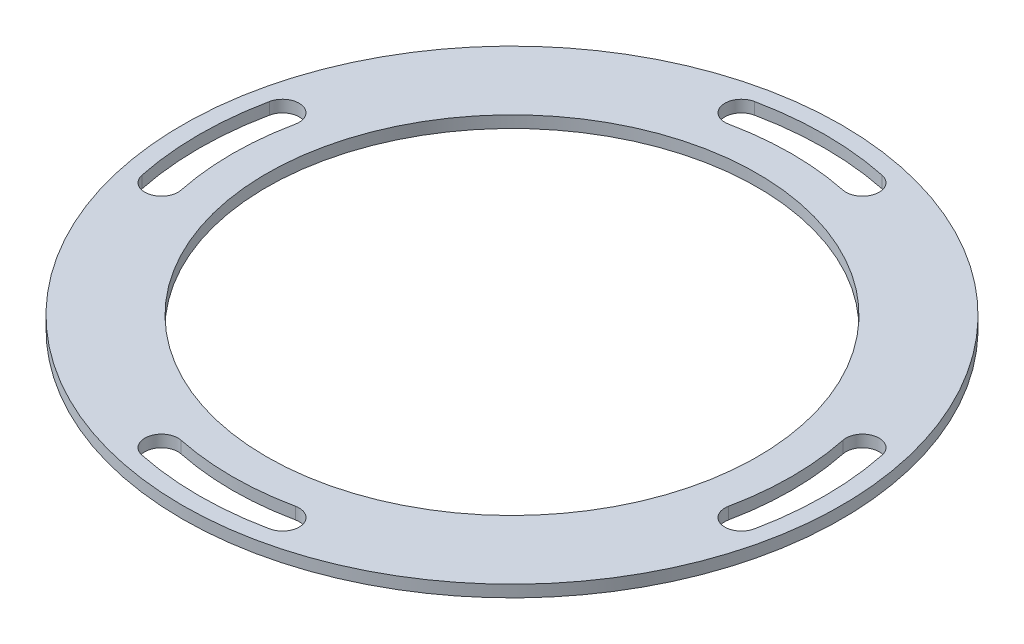
ISO-10303-21;
HEADER;
FILE_DESCRIPTION(('STEP AP214'),'2;1');
FILE_NAME('part.step','',(''),(''),'','','');
FILE_SCHEMA(('AUTOMOTIVE_DESIGN { 1 0 10303 214 1 1 1 1 }'));
ENDSEC;
DATA;
#1=APPLICATION_CONTEXT('core data for automotive mechanical design processes');
#2=APPLICATION_PROTOCOL_DEFINITION('international standard','automotive_design',2000,#1);
#3=PRODUCT_CONTEXT('',#1,'mechanical');
#4=PRODUCT('Part','Part','',(#3));
#5=PRODUCT_RELATED_PRODUCT_CATEGORY('part','',(#4));
#6=PRODUCT_DEFINITION_FORMATION('','',#4);
#7=PRODUCT_DEFINITION_CONTEXT('part definition',#1,'design');
#8=PRODUCT_DEFINITION('design','',#6,#7);
#9=PRODUCT_DEFINITION_SHAPE('','',#8);
#10=(LENGTH_UNIT() NAMED_UNIT(*) SI_UNIT(.MILLI.,.METRE.));
#11=(NAMED_UNIT(*) PLANE_ANGLE_UNIT() SI_UNIT($,.RADIAN.));
#12=(NAMED_UNIT(*) SI_UNIT($,.STERADIAN.) SOLID_ANGLE_UNIT());
#13=UNCERTAINTY_MEASURE_WITH_UNIT(LENGTH_MEASURE(1.E-05),#10,'distance_accuracy_value','');
#14=(GEOMETRIC_REPRESENTATION_CONTEXT(3) GLOBAL_UNCERTAINTY_ASSIGNED_CONTEXT((#13)) GLOBAL_UNIT_ASSIGNED_CONTEXT((#10,
#11,#12)) REPRESENTATION_CONTEXT('',''));
#15=CARTESIAN_POINT('',(0.,0.,0.));
#16=DIRECTION('',(0.,0.,1.));
#17=DIRECTION('',(1.,0.,0.));
#18=AXIS2_PLACEMENT_3D('',#15,#16,#17);
#19=CARTESIAN_POINT('',(0.,2.5,0.));
#20=DIRECTION('',(0.,1.,0.));
#21=DIRECTION('',(0.,0.,1.));
#22=AXIS2_PLACEMENT_3D('',#19,#20,#21);
#23=PLANE('',#22);
#24=CARTESIAN_POINT('',(0.,2.5,0.));
#25=DIRECTION('',(0.,1.,0.));
#26=DIRECTION('',(0.,0.,1.));
#27=AXIS2_PLACEMENT_3D('',#24,#25,#26);
#28=CIRCLE('',#27,139.);
#29=CARTESIAN_POINT('',(0.,2.5,139.));
#30=VERTEX_POINT('',#29);
#31=EDGE_CURVE('E11',#30,#30,#28,.T.);
#32=ORIENTED_EDGE('',*,*,#31,.T.);
#33=EDGE_LOOP('',(#32));
#34=FACE_BOUND('',#33,.T.);
#35=CARTESIAN_POINT('',(0.,2.5,0.));
#36=DIRECTION('',(0.,1.,0.));
#37=DIRECTION('',(0.,0.,1.));
#38=AXIS2_PLACEMENT_3D('',#35,#36,#37);
#39=CIRCLE('',#38,103.5);
#40=CARTESIAN_POINT('',(0.,2.5,103.5));
#41=VERTEX_POINT('',#40);
#42=EDGE_CURVE('E276',#41,#41,#39,.T.);
#43=ORIENTED_EDGE('',*,*,#42,.F.);
#44=EDGE_LOOP('',(#43));
#45=FACE_BOUND('',#44,.T.);
#46=CARTESIAN_POINT('',(-122.320836066701,2.5,25.5288359787017));
#47=DIRECTION('',(0.,1.,0.));
#48=DIRECTION('',(0.,0.,-1.));
#49=AXIS2_PLACEMENT_3D('',#46,#47,#48);
#50=CIRCLE('',#49,7.);
#51=CARTESIAN_POINT('',(-129.173191561911,2.5,26.9589493194052));
#52=VERTEX_POINT('',#51);
#53=CARTESIAN_POINT('',(-115.46848057149,2.5,24.0987226379983));
#54=VERTEX_POINT('',#53);
#55=EDGE_CURVE('E247',#52,#54,#50,.T.);
#56=ORIENTED_EDGE('',*,*,#55,.F.);
#57=CARTESIAN_POINT('',(0.,2.5,0.));
#58=DIRECTION('',(0.,1.,0.));
#59=DIRECTION('',(0.,0.,1.));
#60=AXIS2_PLACEMENT_3D('',#57,#58,#59);
#61=CIRCLE('',#60,131.956426015168);
#62=CARTESIAN_POINT('',(-129.173191561911,2.5,-26.9589493194051));
#63=VERTEX_POINT('',#62);
#64=EDGE_CURVE('E245',#63,#52,#61,.T.);
#65=ORIENTED_EDGE('',*,*,#64,.F.);
#66=CARTESIAN_POINT('',(-122.320836066701,2.5,-25.5288359787017));
#67=DIRECTION('',(0.,1.,0.));
#68=DIRECTION('',(0.,0.,1.));
#69=AXIS2_PLACEMENT_3D('',#66,#67,#68);
#70=CIRCLE('',#69,7.);
#71=CARTESIAN_POINT('',(-115.46848057149,2.5,-24.0987226379983));
#72=VERTEX_POINT('',#71);
#73=EDGE_CURVE('E253',#72,#63,#70,.T.);
#74=ORIENTED_EDGE('',*,*,#73,.F.);
#75=CARTESIAN_POINT('',(0.,2.5,0.));
#76=DIRECTION('',(0.,-1.,0.));
#77=DIRECTION('',(0.,0.,1.));
#78=AXIS2_PLACEMENT_3D('',#75,#76,#77);
#79=CIRCLE('',#78,117.956426015168);
#80=EDGE_CURVE('E250',#54,#72,#79,.T.);
#81=ORIENTED_EDGE('',*,*,#80,.F.);
#82=EDGE_LOOP('',(#56,#65,#74,#81));
#83=FACE_BOUND('',#82,.T.);
#84=CARTESIAN_POINT('',(0.,2.5,0.));
#85=DIRECTION('',(0.,1.,0.));
#86=DIRECTION('',(0.,0.,1.));
#87=AXIS2_PLACEMENT_3D('',#84,#85,#86);
#88=CIRCLE('',#87,131.956426015168);
#89=CARTESIAN_POINT('',(26.9589493194056,2.5,-129.173191561911));
#90=VERTEX_POINT('',#89);
#91=CARTESIAN_POINT('',(-26.9589493194047,2.5,-129.173191561911));
#92=VERTEX_POINT('',#91);
#93=EDGE_CURVE('E216',#90,#92,#88,.T.);
#94=ORIENTED_EDGE('',*,*,#93,.F.);
#95=CARTESIAN_POINT('',(25.5288359787021,2.5,-122.320836066701));
#96=DIRECTION('',(0.,1.,0.));
#97=DIRECTION('',(0.,0.,1.));
#98=AXIS2_PLACEMENT_3D('',#95,#96,#97);
#99=CIRCLE('',#98,7.00000000000001);
#100=CARTESIAN_POINT('',(24.0987226379987,2.5,-115.46848057149));
#101=VERTEX_POINT('',#100);
#102=EDGE_CURVE('E214',#101,#90,#99,.T.);
#103=ORIENTED_EDGE('',*,*,#102,.F.);
#104=CARTESIAN_POINT('',(0.,2.5,0.));
#105=DIRECTION('',(0.,-1.,0.));
#106=DIRECTION('',(0.,0.,1.));
#107=AXIS2_PLACEMENT_3D('',#104,#105,#106);
#108=CIRCLE('',#107,117.956426015168);
#109=CARTESIAN_POINT('',(-24.0987226379979,2.5,-115.46848057149));
#110=VERTEX_POINT('',#109);
#111=EDGE_CURVE('E222',#110,#101,#108,.T.);
#112=ORIENTED_EDGE('',*,*,#111,.F.);
#113=CARTESIAN_POINT('',(-25.5288359787013,2.5,-122.320836066701));
#114=DIRECTION('',(0.,1.,0.));
#115=DIRECTION('',(0.,0.,-1.));
#116=AXIS2_PLACEMENT_3D('',#113,#114,#115);
#117=CIRCLE('',#116,7.);
#118=EDGE_CURVE('E219',#92,#110,#117,.T.);
#119=ORIENTED_EDGE('',*,*,#118,.F.);
#120=EDGE_LOOP('',(#94,#103,#112,#119));
#121=FACE_BOUND('',#120,.T.);
#122=CARTESIAN_POINT('',(0.,2.5,0.));
#123=DIRECTION('',(0.,1.,0.));
#124=DIRECTION('',(0.,0.,1.));
#125=AXIS2_PLACEMENT_3D('',#122,#123,#124);
#126=CIRCLE('',#125,131.956426015168);
#127=CARTESIAN_POINT('',(129.173191561911,2.5,26.958949319406));
#128=VERTEX_POINT('',#127);
#129=CARTESIAN_POINT('',(129.173191561911,2.5,-26.9589493194043));
#130=VERTEX_POINT('',#129);
#131=EDGE_CURVE('E185',#128,#130,#126,.T.);
#132=ORIENTED_EDGE('',*,*,#131,.F.);
#133=CARTESIAN_POINT('',(122.320836066701,2.5,25.5288359787026));
#134=DIRECTION('',(0.,1.,0.));
#135=DIRECTION('',(0.,0.,1.));
#136=AXIS2_PLACEMENT_3D('',#133,#134,#135);
#137=CIRCLE('',#136,7.);
#138=CARTESIAN_POINT('',(115.46848057149,2.5,24.0987226379991));
#139=VERTEX_POINT('',#138);
#140=EDGE_CURVE('E183',#139,#128,#137,.T.);
#141=ORIENTED_EDGE('',*,*,#140,.F.);
#142=CARTESIAN_POINT('',(0.,2.5,0.));
#143=DIRECTION('',(0.,-1.,0.));
#144=DIRECTION('',(0.,0.,1.));
#145=AXIS2_PLACEMENT_3D('',#142,#143,#144);
#146=CIRCLE('',#145,117.956426015168);
#147=CARTESIAN_POINT('',(115.46848057149,2.5,-24.0987226379975));
#148=VERTEX_POINT('',#147);
#149=EDGE_CURVE('E191',#148,#139,#146,.T.);
#150=ORIENTED_EDGE('',*,*,#149,.F.);
#151=CARTESIAN_POINT('',(122.320836066701,2.5,-25.5288359787009));
#152=DIRECTION('',(0.,1.,0.));
#153=DIRECTION('',(0.,0.,-1.));
#154=AXIS2_PLACEMENT_3D('',#151,#152,#153);
#155=CIRCLE('',#154,7.00000000000001);
#156=EDGE_CURVE('E188',#130,#148,#155,.T.);
#157=ORIENTED_EDGE('',*,*,#156,.F.);
#158=EDGE_LOOP('',(#132,#141,#150,#157));
#159=FACE_BOUND('',#158,.T.);
#160=CARTESIAN_POINT('',(0.,2.5,0.));
#161=DIRECTION('',(0.,1.,0.));
#162=DIRECTION('',(0.,0.,1.));
#163=AXIS2_PLACEMENT_3D('',#160,#161,#162);
#164=CIRCLE('',#163,131.956426015168);
#165=CARTESIAN_POINT('',(-26.9589493194066,2.5,129.173191561911));
#166=VERTEX_POINT('',#165);
#167=CARTESIAN_POINT('',(26.9589493194038,2.5,129.173191561912));
#168=VERTEX_POINT('',#167);
#169=EDGE_CURVE('E155',#166,#168,#164,.T.);
#170=ORIENTED_EDGE('',*,*,#169,.F.);
#171=CARTESIAN_POINT('',(-25.528835978703,2.5,122.3208360667));
#172=DIRECTION('',(0.,1.,0.));
#173=DIRECTION('',(0.,0.,1.));
#174=AXIS2_PLACEMENT_3D('',#171,#172,#173);
#175=CIRCLE('',#174,7.);
#176=CARTESIAN_POINT('',(-24.0987226379996,2.5,115.46848057149));
#177=VERTEX_POINT('',#176);
#178=EDGE_CURVE('E147',#177,#166,#175,.T.);
#179=ORIENTED_EDGE('',*,*,#178,.F.);
#180=CARTESIAN_POINT('',(0.,2.5,0.));
#181=DIRECTION('',(0.,-1.,0.));
#182=DIRECTION('',(0.,0.,1.));
#183=AXIS2_PLACEMENT_3D('',#180,#181,#182);
#184=CIRCLE('',#183,117.956426015168);
#185=CARTESIAN_POINT('',(24.0987226379971,2.5,115.46848057149));
#186=VERTEX_POINT('',#185);
#187=EDGE_CURVE('E169',#186,#177,#184,.T.);
#188=ORIENTED_EDGE('',*,*,#187,.F.);
#189=CARTESIAN_POINT('',(25.5288359787005,2.5,122.320836066701));
#190=DIRECTION('',(0.,1.,0.));
#191=DIRECTION('',(0.,0.,-1.));
#192=AXIS2_PLACEMENT_3D('',#189,#190,#191);
#193=CIRCLE('',#192,7.);
#194=EDGE_CURVE('E167',#168,#186,#193,.T.);
#195=ORIENTED_EDGE('',*,*,#194,.F.);
#196=EDGE_LOOP('',(#170,#179,#188,#195));
#197=FACE_BOUND('',#196,.T.);
#198=ADVANCED_FACE('F34',(#34,#45,#83,#121,#159,#197),#23,.T.);
#199=CARTESIAN_POINT('',(0.,-2.5,0.));
#200=DIRECTION('',(0.,1.,0.));
#201=DIRECTION('',(0.,0.,1.));
#202=AXIS2_PLACEMENT_3D('',#199,#200,#201);
#203=PLANE('',#202);
#204=CARTESIAN_POINT('',(122.320836066701,-2.5,25.5288359787026));
#205=DIRECTION('',(0.,1.,0.));
#206=DIRECTION('',(0.,0.,1.));
#207=AXIS2_PLACEMENT_3D('',#204,#205,#206);
#208=CIRCLE('',#207,7.);
#209=CARTESIAN_POINT('',(115.46848057149,-2.5,24.0987226379991));
#210=VERTEX_POINT('',#209);
#211=CARTESIAN_POINT('',(129.173191561911,-2.5,26.958949319406));
#212=VERTEX_POINT('',#211);
#213=EDGE_CURVE('E163',#210,#212,#208,.T.);
#214=ORIENTED_EDGE('',*,*,#213,.T.);
#215=CARTESIAN_POINT('',(0.,-2.5,0.));
#216=DIRECTION('',(0.,1.,0.));
#217=DIRECTION('',(0.,0.,1.));
#218=AXIS2_PLACEMENT_3D('',#215,#216,#217);
#219=CIRCLE('',#218,131.956426015168);
#220=CARTESIAN_POINT('',(129.173191561911,-2.5,-26.9589493194043));
#221=VERTEX_POINT('',#220);
#222=EDGE_CURVE('E196',#212,#221,#219,.T.);
#223=ORIENTED_EDGE('',*,*,#222,.T.);
#224=CARTESIAN_POINT('',(122.320836066701,-2.5,-25.5288359787009));
#225=DIRECTION('',(0.,1.,0.));
#226=DIRECTION('',(0.,0.,-1.));
#227=AXIS2_PLACEMENT_3D('',#224,#225,#226);
#228=CIRCLE('',#227,7.00000000000001);
#229=CARTESIAN_POINT('',(115.46848057149,-2.5,-24.0987226379975));
#230=VERTEX_POINT('',#229);
#231=EDGE_CURVE('E199',#221,#230,#228,.T.);
#232=ORIENTED_EDGE('',*,*,#231,.T.);
#233=CARTESIAN_POINT('',(0.,-2.5,0.));
#234=DIRECTION('',(0.,-1.,0.));
#235=DIRECTION('',(0.,0.,1.));
#236=AXIS2_PLACEMENT_3D('',#233,#234,#235);
#237=CIRCLE('',#236,117.956426015168);
#238=EDGE_CURVE('E186',#230,#210,#237,.T.);
#239=ORIENTED_EDGE('',*,*,#238,.T.);
#240=EDGE_LOOP('',(#214,#223,#232,#239));
#241=FACE_BOUND('',#240,.T.);
#242=CARTESIAN_POINT('',(0.,-2.5,0.));
#243=DIRECTION('',(0.,1.,0.));
#244=DIRECTION('',(0.,0.,1.));
#245=AXIS2_PLACEMENT_3D('',#242,#243,#244);
#246=CIRCLE('',#245,131.956426015168);
#247=CARTESIAN_POINT('',(-129.173191561911,-2.5,-26.9589493194051));
#248=VERTEX_POINT('',#247);
#249=CARTESIAN_POINT('',(-129.173191561911,-2.5,26.9589493194052));
#250=VERTEX_POINT('',#249);
#251=EDGE_CURVE('E244',#248,#250,#246,.T.);
#252=ORIENTED_EDGE('',*,*,#251,.T.);
#253=CARTESIAN_POINT('',(-122.320836066701,-2.5,25.5288359787017));
#254=DIRECTION('',(0.,1.,0.));
#255=DIRECTION('',(0.,0.,-1.));
#256=AXIS2_PLACEMENT_3D('',#253,#254,#255);
#257=CIRCLE('',#256,7.);
#258=CARTESIAN_POINT('',(-115.46848057149,-2.5,24.0987226379983));
#259=VERTEX_POINT('',#258);
#260=EDGE_CURVE('E258',#250,#259,#257,.T.);
#261=ORIENTED_EDGE('',*,*,#260,.T.);
#262=CARTESIAN_POINT('',(0.,-2.5,0.));
#263=DIRECTION('',(0.,-1.,0.));
#264=DIRECTION('',(0.,0.,1.));
#265=AXIS2_PLACEMENT_3D('',#262,#263,#264);
#266=CIRCLE('',#265,117.956426015168);
#267=CARTESIAN_POINT('',(-115.46848057149,-2.5,-24.0987226379983));
#268=VERTEX_POINT('',#267);
#269=EDGE_CURVE('E261',#259,#268,#266,.T.);
#270=ORIENTED_EDGE('',*,*,#269,.T.);
#271=CARTESIAN_POINT('',(-122.320836066701,-2.5,-25.5288359787017));
#272=DIRECTION('',(0.,1.,0.));
#273=DIRECTION('',(0.,0.,1.));
#274=AXIS2_PLACEMENT_3D('',#271,#272,#273);
#275=CIRCLE('',#274,7.);
#276=EDGE_CURVE('E248',#268,#248,#275,.T.);
#277=ORIENTED_EDGE('',*,*,#276,.T.);
#278=EDGE_LOOP('',(#252,#261,#270,#277));
#279=FACE_BOUND('',#278,.T.);
#280=CARTESIAN_POINT('',(0.,-2.5,0.));
#281=DIRECTION('',(0.,1.,0.));
#282=DIRECTION('',(0.,0.,1.));
#283=AXIS2_PLACEMENT_3D('',#280,#281,#282);
#284=CIRCLE('',#283,139.);
#285=CARTESIAN_POINT('',(0.,-2.5,139.));
#286=VERTEX_POINT('',#285);
#287=EDGE_CURVE('E38',#286,#286,#284,.T.);
#288=ORIENTED_EDGE('',*,*,#287,.F.);
#289=EDGE_LOOP('',(#288));
#290=FACE_BOUND('',#289,.T.);
#291=CARTESIAN_POINT('',(0.,-2.5,0.));
#292=DIRECTION('',(0.,1.,0.));
#293=DIRECTION('',(0.,0.,1.));
#294=AXIS2_PLACEMENT_3D('',#291,#292,#293);
#295=CIRCLE('',#294,103.5);
#296=CARTESIAN_POINT('',(0.,-2.5,103.5));
#297=VERTEX_POINT('',#296);
#298=EDGE_CURVE('E275',#297,#297,#295,.T.);
#299=ORIENTED_EDGE('',*,*,#298,.T.);
#300=EDGE_LOOP('',(#299));
#301=FACE_BOUND('',#300,.T.);
#302=CARTESIAN_POINT('',(25.5288359787021,-2.5,-122.320836066701));
#303=DIRECTION('',(0.,1.,0.));
#304=DIRECTION('',(0.,0.,1.));
#305=AXIS2_PLACEMENT_3D('',#302,#303,#304);
#306=CIRCLE('',#305,7.00000000000001);
#307=CARTESIAN_POINT('',(24.0987226379987,-2.5,-115.46848057149));
#308=VERTEX_POINT('',#307);
#309=CARTESIAN_POINT('',(26.9589493194056,-2.5,-129.173191561911));
#310=VERTEX_POINT('',#309);
#311=EDGE_CURVE('E213',#308,#310,#306,.T.);
#312=ORIENTED_EDGE('',*,*,#311,.T.);
#313=CARTESIAN_POINT('',(0.,-2.5,0.));
#314=DIRECTION('',(0.,1.,0.));
#315=DIRECTION('',(0.,0.,1.));
#316=AXIS2_PLACEMENT_3D('',#313,#314,#315);
#317=CIRCLE('',#316,131.956426015168);
#318=CARTESIAN_POINT('',(-26.9589493194047,-2.5,-129.173191561911));
#319=VERTEX_POINT('',#318);
#320=EDGE_CURVE('E227',#310,#319,#317,.T.);
#321=ORIENTED_EDGE('',*,*,#320,.T.);
#322=CARTESIAN_POINT('',(-25.5288359787013,-2.5,-122.320836066701));
#323=DIRECTION('',(0.,1.,0.));
#324=DIRECTION('',(0.,0.,-1.));
#325=AXIS2_PLACEMENT_3D('',#322,#323,#324);
#326=CIRCLE('',#325,7.);
#327=CARTESIAN_POINT('',(-24.0987226379979,-2.5,-115.46848057149));
#328=VERTEX_POINT('',#327);
#329=EDGE_CURVE('E230',#319,#328,#326,.T.);
#330=ORIENTED_EDGE('',*,*,#329,.T.);
#331=CARTESIAN_POINT('',(0.,-2.5,0.));
#332=DIRECTION('',(0.,-1.,0.));
#333=DIRECTION('',(0.,0.,1.));
#334=AXIS2_PLACEMENT_3D('',#331,#332,#333);
#335=CIRCLE('',#334,117.956426015168);
#336=EDGE_CURVE('E217',#328,#308,#335,.T.);
#337=ORIENTED_EDGE('',*,*,#336,.T.);
#338=EDGE_LOOP('',(#312,#321,#330,#337));
#339=FACE_BOUND('',#338,.T.);
#340=CARTESIAN_POINT('',(-25.528835978703,-2.5,122.3208360667));
#341=DIRECTION('',(0.,1.,0.));
#342=DIRECTION('',(0.,0.,1.));
#343=AXIS2_PLACEMENT_3D('',#340,#341,#342);
#344=CIRCLE('',#343,7.);
#345=CARTESIAN_POINT('',(-24.0987226379996,-2.5,115.46848057149));
#346=VERTEX_POINT('',#345);
#347=CARTESIAN_POINT('',(-26.9589493194066,-2.5,129.173191561911));
#348=VERTEX_POINT('',#347);
#349=EDGE_CURVE('E57',#346,#348,#344,.T.);
#350=ORIENTED_EDGE('',*,*,#349,.T.);
#351=CARTESIAN_POINT('',(0.,-2.5,0.));
#352=DIRECTION('',(0.,1.,0.));
#353=DIRECTION('',(0.,0.,1.));
#354=AXIS2_PLACEMENT_3D('',#351,#352,#353);
#355=CIRCLE('',#354,131.956426015168);
#356=CARTESIAN_POINT('',(26.9589493194038,-2.5,129.173191561912));
#357=VERTEX_POINT('',#356);
#358=EDGE_CURVE('E162',#348,#357,#355,.T.);
#359=ORIENTED_EDGE('',*,*,#358,.T.);
#360=CARTESIAN_POINT('',(25.5288359787005,-2.5,122.320836066701));
#361=DIRECTION('',(0.,1.,0.));
#362=DIRECTION('',(0.,0.,-1.));
#363=AXIS2_PLACEMENT_3D('',#360,#361,#362);
#364=CIRCLE('',#363,7.);
#365=CARTESIAN_POINT('',(24.0987226379971,-2.5,115.46848057149));
#366=VERTEX_POINT('',#365);
#367=EDGE_CURVE('E175',#357,#366,#364,.T.);
#368=ORIENTED_EDGE('',*,*,#367,.T.);
#369=CARTESIAN_POINT('',(0.,-2.5,0.));
#370=DIRECTION('',(0.,-1.,0.));
#371=DIRECTION('',(0.,0.,1.));
#372=AXIS2_PLACEMENT_3D('',#369,#370,#371);
#373=CIRCLE('',#372,117.956426015168);
#374=EDGE_CURVE('E156',#366,#346,#373,.T.);
#375=ORIENTED_EDGE('',*,*,#374,.T.);
#376=EDGE_LOOP('',(#350,#359,#368,#375));
#377=FACE_BOUND('',#376,.T.);
#378=ADVANCED_FACE('F282',(#241,#279,#290,#301,#339,#377),#203,.F.);
#379=CARTESIAN_POINT('',(0.,2.5,0.));
#380=DIRECTION('',(0.,-1.,0.));
#381=DIRECTION('',(0.,0.,-1.));
#382=AXIS2_PLACEMENT_3D('',#379,#380,#381);
#383=CYLINDRICAL_SURFACE('',#382,139.);
#384=ORIENTED_EDGE('',*,*,#31,.F.);
#385=EDGE_LOOP('',(#384));
#386=FACE_BOUND('',#385,.T.);
#387=ORIENTED_EDGE('',*,*,#287,.T.);
#388=EDGE_LOOP('',(#387));
#389=FACE_BOUND('',#388,.T.);
#390=ADVANCED_FACE('F36',(#386,#389),#383,.T.);
#391=CARTESIAN_POINT('',(0.,2.5,0.));
#392=DIRECTION('',(0.,-1.,0.));
#393=DIRECTION('',(0.,0.,-1.));
#394=AXIS2_PLACEMENT_3D('',#391,#392,#393);
#395=CYLINDRICAL_SURFACE('',#394,103.5);
#396=ORIENTED_EDGE('',*,*,#42,.T.);
#397=EDGE_LOOP('',(#396));
#398=FACE_BOUND('',#397,.T.);
#399=ORIENTED_EDGE('',*,*,#298,.F.);
#400=EDGE_LOOP('',(#399));
#401=FACE_BOUND('',#400,.T.);
#402=ADVANCED_FACE('F285',(#398,#401),#395,.F.);
#403=CARTESIAN_POINT('',(0.,2.5,0.));
#404=DIRECTION('',(0.,-1.,0.));
#405=DIRECTION('',(0.,0.,-1.));
#406=AXIS2_PLACEMENT_3D('',#403,#404,#405);
#407=CYLINDRICAL_SURFACE('',#406,131.956426015168);
#408=ORIENTED_EDGE('',*,*,#251,.F.);
#409=DIRECTION('',(0.,-1.,0.));
#410=VECTOR('',#409,1.);
#411=CARTESIAN_POINT('',(-129.173191561911,2.5,-26.9589493194051));
#412=LINE('',#411,#410);
#413=EDGE_CURVE('E255',#63,#248,#412,.T.);
#414=ORIENTED_EDGE('',*,*,#413,.F.);
#415=ORIENTED_EDGE('',*,*,#64,.T.);
#416=DIRECTION('',(0.,-1.,0.));
#417=VECTOR('',#416,1.);
#418=CARTESIAN_POINT('',(-129.173191561911,2.5,26.9589493194052));
#419=LINE('',#418,#417);
#420=EDGE_CURVE('E272',#52,#250,#419,.T.);
#421=ORIENTED_EDGE('',*,*,#420,.T.);
#422=EDGE_LOOP('',(#408,#414,#415,#421));
#423=FACE_BOUND('',#422,.T.);
#424=ADVANCED_FACE('F287',(#423),#407,.F.);
#425=CARTESIAN_POINT('',(-122.320836066701,2.5,25.5288359787017));
#426=DIRECTION('',(0.,-1.,0.));
#427=DIRECTION('',(0.,0.,-1.));
#428=AXIS2_PLACEMENT_3D('',#425,#426,#427);
#429=CYLINDRICAL_SURFACE('',#428,7.);
#430=ORIENTED_EDGE('',*,*,#260,.F.);
#431=ORIENTED_EDGE('',*,*,#420,.F.);
#432=ORIENTED_EDGE('',*,*,#55,.T.);
#433=DIRECTION('',(0.,-1.,0.));
#434=VECTOR('',#433,1.);
#435=CARTESIAN_POINT('',(-115.46848057149,2.5,24.0987226379983));
#436=LINE('',#435,#434);
#437=EDGE_CURVE('E270',#54,#259,#436,.T.);
#438=ORIENTED_EDGE('',*,*,#437,.T.);
#439=EDGE_LOOP('',(#430,#431,#432,#438));
#440=FACE_BOUND('',#439,.T.);
#441=ADVANCED_FACE('F294',(#440),#429,.F.);
#442=CARTESIAN_POINT('',(0.,2.5,0.));
#443=DIRECTION('',(0.,-1.,0.));
#444=DIRECTION('',(0.,0.,-1.));
#445=AXIS2_PLACEMENT_3D('',#442,#443,#444);
#446=CYLINDRICAL_SURFACE('',#445,117.956426015168);
#447=ORIENTED_EDGE('',*,*,#269,.F.);
#448=ORIENTED_EDGE('',*,*,#437,.F.);
#449=ORIENTED_EDGE('',*,*,#80,.T.);
#450=DIRECTION('',(0.,-1.,0.));
#451=VECTOR('',#450,1.);
#452=CARTESIAN_POINT('',(-115.46848057149,2.5,-24.0987226379983));
#453=LINE('',#452,#451);
#454=EDGE_CURVE('E268',#72,#268,#453,.T.);
#455=ORIENTED_EDGE('',*,*,#454,.T.);
#456=EDGE_LOOP('',(#447,#448,#449,#455));
#457=FACE_BOUND('',#456,.T.);
#458=ADVANCED_FACE('F368',(#457),#446,.T.);
#459=CARTESIAN_POINT('',(-122.320836066701,2.5,-25.5288359787017));
#460=DIRECTION('',(0.,-1.,0.));
#461=DIRECTION('',(0.,0.,-1.));
#462=AXIS2_PLACEMENT_3D('',#459,#460,#461);
#463=CYLINDRICAL_SURFACE('',#462,7.);
#464=ORIENTED_EDGE('',*,*,#276,.F.);
#465=ORIENTED_EDGE('',*,*,#454,.F.);
#466=ORIENTED_EDGE('',*,*,#73,.T.);
#467=ORIENTED_EDGE('',*,*,#413,.T.);
#468=EDGE_LOOP('',(#464,#465,#466,#467));
#469=FACE_BOUND('',#468,.T.);
#470=ADVANCED_FACE('F364',(#469),#463,.F.);
#471=CARTESIAN_POINT('',(25.5288359787021,2.5,-122.320836066701));
#472=DIRECTION('',(0.,-1.,0.));
#473=DIRECTION('',(0.,0.,-1.));
#474=AXIS2_PLACEMENT_3D('',#471,#472,#473);
#475=CYLINDRICAL_SURFACE('',#474,7.00000000000001);
#476=ORIENTED_EDGE('',*,*,#311,.F.);
#477=DIRECTION('',(0.,-1.,0.));
#478=VECTOR('',#477,1.);
#479=CARTESIAN_POINT('',(24.0987226379987,2.5,-115.46848057149));
#480=LINE('',#479,#478);
#481=EDGE_CURVE('E224',#101,#308,#480,.T.);
#482=ORIENTED_EDGE('',*,*,#481,.F.);
#483=ORIENTED_EDGE('',*,*,#102,.T.);
#484=DIRECTION('',(0.,-1.,0.));
#485=VECTOR('',#484,1.);
#486=CARTESIAN_POINT('',(26.9589493194056,2.5,-129.173191561911));
#487=LINE('',#486,#485);
#488=EDGE_CURVE('E241',#90,#310,#487,.T.);
#489=ORIENTED_EDGE('',*,*,#488,.T.);
#490=EDGE_LOOP('',(#476,#482,#483,#489));
#491=FACE_BOUND('',#490,.T.);
#492=ADVANCED_FACE('F360',(#491),#475,.F.);
#493=CARTESIAN_POINT('',(0.,2.5,0.));
#494=DIRECTION('',(0.,-1.,0.));
#495=DIRECTION('',(0.,0.,-1.));
#496=AXIS2_PLACEMENT_3D('',#493,#494,#495);
#497=CYLINDRICAL_SURFACE('',#496,131.956426015168);
#498=ORIENTED_EDGE('',*,*,#320,.F.);
#499=ORIENTED_EDGE('',*,*,#488,.F.);
#500=ORIENTED_EDGE('',*,*,#93,.T.);
#501=DIRECTION('',(0.,-1.,0.));
#502=VECTOR('',#501,1.);
#503=CARTESIAN_POINT('',(-26.9589493194047,2.5,-129.173191561911));
#504=LINE('',#503,#502);
#505=EDGE_CURVE('E239',#92,#319,#504,.T.);
#506=ORIENTED_EDGE('',*,*,#505,.T.);
#507=EDGE_LOOP('',(#498,#499,#500,#506));
#508=FACE_BOUND('',#507,.T.);
#509=ADVANCED_FACE('F356',(#508),#497,.F.);
#510=CARTESIAN_POINT('',(-25.5288359787013,2.5,-122.320836066701));
#511=DIRECTION('',(0.,-1.,0.));
#512=DIRECTION('',(0.,0.,-1.));
#513=AXIS2_PLACEMENT_3D('',#510,#511,#512);
#514=CYLINDRICAL_SURFACE('',#513,7.);
#515=ORIENTED_EDGE('',*,*,#329,.F.);
#516=ORIENTED_EDGE('',*,*,#505,.F.);
#517=ORIENTED_EDGE('',*,*,#118,.T.);
#518=DIRECTION('',(0.,-1.,0.));
#519=VECTOR('',#518,1.);
#520=CARTESIAN_POINT('',(-24.0987226379979,2.5,-115.46848057149));
#521=LINE('',#520,#519);
#522=EDGE_CURVE('E237',#110,#328,#521,.T.);
#523=ORIENTED_EDGE('',*,*,#522,.T.);
#524=EDGE_LOOP('',(#515,#516,#517,#523));
#525=FACE_BOUND('',#524,.T.);
#526=ADVANCED_FACE('F352',(#525),#514,.F.);
#527=CARTESIAN_POINT('',(0.,2.5,0.));
#528=DIRECTION('',(0.,-1.,0.));
#529=DIRECTION('',(0.,0.,-1.));
#530=AXIS2_PLACEMENT_3D('',#527,#528,#529);
#531=CYLINDRICAL_SURFACE('',#530,117.956426015168);
#532=ORIENTED_EDGE('',*,*,#336,.F.);
#533=ORIENTED_EDGE('',*,*,#522,.F.);
#534=ORIENTED_EDGE('',*,*,#111,.T.);
#535=ORIENTED_EDGE('',*,*,#481,.T.);
#536=EDGE_LOOP('',(#532,#533,#534,#535));
#537=FACE_BOUND('',#536,.T.);
#538=ADVANCED_FACE('F349',(#537),#531,.T.);
#539=CARTESIAN_POINT('',(122.320836066701,2.5,25.5288359787026));
#540=DIRECTION('',(0.,-1.,0.));
#541=DIRECTION('',(0.,0.,-1.));
#542=AXIS2_PLACEMENT_3D('',#539,#540,#541);
#543=CYLINDRICAL_SURFACE('',#542,7.);
#544=ORIENTED_EDGE('',*,*,#213,.F.);
#545=DIRECTION('',(0.,-1.,0.));
#546=VECTOR('',#545,1.);
#547=CARTESIAN_POINT('',(115.46848057149,2.5,24.0987226379991));
#548=LINE('',#547,#546);
#549=EDGE_CURVE('E193',#139,#210,#548,.T.);
#550=ORIENTED_EDGE('',*,*,#549,.F.);
#551=ORIENTED_EDGE('',*,*,#140,.T.);
#552=DIRECTION('',(0.,-1.,0.));
#553=VECTOR('',#552,1.);
#554=CARTESIAN_POINT('',(129.173191561911,2.5,26.958949319406));
#555=LINE('',#554,#553);
#556=EDGE_CURVE('E210',#128,#212,#555,.T.);
#557=ORIENTED_EDGE('',*,*,#556,.T.);
#558=EDGE_LOOP('',(#544,#550,#551,#557));
#559=FACE_BOUND('',#558,.T.);
#560=ADVANCED_FACE('F331',(#559),#543,.F.);
#561=CARTESIAN_POINT('',(0.,2.5,0.));
#562=DIRECTION('',(0.,-1.,0.));
#563=DIRECTION('',(0.,0.,-1.));
#564=AXIS2_PLACEMENT_3D('',#561,#562,#563);
#565=CYLINDRICAL_SURFACE('',#564,131.956426015168);
#566=ORIENTED_EDGE('',*,*,#222,.F.);
#567=ORIENTED_EDGE('',*,*,#556,.F.);
#568=ORIENTED_EDGE('',*,*,#131,.T.);
#569=DIRECTION('',(0.,-1.,0.));
#570=VECTOR('',#569,1.);
#571=CARTESIAN_POINT('',(129.173191561911,2.5,-26.9589493194043));
#572=LINE('',#571,#570);
#573=EDGE_CURVE('E208',#130,#221,#572,.T.);
#574=ORIENTED_EDGE('',*,*,#573,.T.);
#575=EDGE_LOOP('',(#566,#567,#568,#574));
#576=FACE_BOUND('',#575,.T.);
#577=ADVANCED_FACE('F324',(#576),#565,.F.);
#578=CARTESIAN_POINT('',(122.320836066701,2.5,-25.5288359787009));
#579=DIRECTION('',(0.,-1.,0.));
#580=DIRECTION('',(0.,0.,-1.));
#581=AXIS2_PLACEMENT_3D('',#578,#579,#580);
#582=CYLINDRICAL_SURFACE('',#581,7.00000000000001);
#583=ORIENTED_EDGE('',*,*,#231,.F.);
#584=ORIENTED_EDGE('',*,*,#573,.F.);
#585=ORIENTED_EDGE('',*,*,#156,.T.);
#586=DIRECTION('',(0.,-1.,0.));
#587=VECTOR('',#586,1.);
#588=CARTESIAN_POINT('',(115.46848057149,2.5,-24.0987226379975));
#589=LINE('',#588,#587);
#590=EDGE_CURVE('E206',#148,#230,#589,.T.);
#591=ORIENTED_EDGE('',*,*,#590,.T.);
#592=EDGE_LOOP('',(#583,#584,#585,#591));
#593=FACE_BOUND('',#592,.T.);
#594=ADVANCED_FACE('F327',(#593),#582,.F.);
#595=CARTESIAN_POINT('',(0.,2.5,0.));
#596=DIRECTION('',(0.,-1.,0.));
#597=DIRECTION('',(0.,0.,-1.));
#598=AXIS2_PLACEMENT_3D('',#595,#596,#597);
#599=CYLINDRICAL_SURFACE('',#598,117.956426015168);
#600=ORIENTED_EDGE('',*,*,#238,.F.);
#601=ORIENTED_EDGE('',*,*,#590,.F.);
#602=ORIENTED_EDGE('',*,*,#149,.T.);
#603=ORIENTED_EDGE('',*,*,#549,.T.);
#604=EDGE_LOOP('',(#600,#601,#602,#603));
#605=FACE_BOUND('',#604,.T.);
#606=ADVANCED_FACE('F334',(#605),#599,.T.);
#607=CARTESIAN_POINT('',(-25.528835978703,2.5,122.3208360667));
#608=DIRECTION('',(0.,-1.,0.));
#609=DIRECTION('',(0.,0.,-1.));
#610=AXIS2_PLACEMENT_3D('',#607,#608,#609);
#611=CYLINDRICAL_SURFACE('',#610,7.);
#612=ORIENTED_EDGE('',*,*,#349,.F.);
#613=DIRECTION('',(0.,-1.,0.));
#614=VECTOR('',#613,1.);
#615=CARTESIAN_POINT('',(-24.0987226379996,2.5,115.46848057149));
#616=LINE('',#615,#614);
#617=EDGE_CURVE('E151',#177,#346,#616,.T.);
#618=ORIENTED_EDGE('',*,*,#617,.F.);
#619=ORIENTED_EDGE('',*,*,#178,.T.);
#620=DIRECTION('',(0.,-1.,0.));
#621=VECTOR('',#620,1.);
#622=CARTESIAN_POINT('',(-26.9589493194066,2.5,129.173191561911));
#623=LINE('',#622,#621);
#624=EDGE_CURVE('E150',#166,#348,#623,.T.);
#625=ORIENTED_EDGE('',*,*,#624,.T.);
#626=EDGE_LOOP('',(#612,#618,#619,#625));
#627=FACE_BOUND('',#626,.T.);
#628=ADVANCED_FACE('F149',(#627),#611,.F.);
#629=CARTESIAN_POINT('',(0.,2.5,0.));
#630=DIRECTION('',(0.,-1.,0.));
#631=DIRECTION('',(0.,0.,-1.));
#632=AXIS2_PLACEMENT_3D('',#629,#630,#631);
#633=CYLINDRICAL_SURFACE('',#632,131.956426015168);
#634=ORIENTED_EDGE('',*,*,#358,.F.);
#635=ORIENTED_EDGE('',*,*,#624,.F.);
#636=ORIENTED_EDGE('',*,*,#169,.T.);
#637=DIRECTION('',(0.,-1.,0.));
#638=VECTOR('',#637,1.);
#639=CARTESIAN_POINT('',(26.9589493194038,2.5,129.173191561912));
#640=LINE('',#639,#638);
#641=EDGE_CURVE('E164',#168,#357,#640,.T.);
#642=ORIENTED_EDGE('',*,*,#641,.T.);
#643=EDGE_LOOP('',(#634,#635,#636,#642));
#644=FACE_BOUND('',#643,.T.);
#645=ADVANCED_FACE('F159',(#644),#633,.F.);
#646=CARTESIAN_POINT('',(25.5288359787005,2.5,122.320836066701));
#647=DIRECTION('',(0.,-1.,0.));
#648=DIRECTION('',(0.,0.,-1.));
#649=AXIS2_PLACEMENT_3D('',#646,#647,#648);
#650=CYLINDRICAL_SURFACE('',#649,7.);
#651=ORIENTED_EDGE('',*,*,#367,.F.);
#652=ORIENTED_EDGE('',*,*,#641,.F.);
#653=ORIENTED_EDGE('',*,*,#194,.T.);
#654=DIRECTION('',(0.,-1.,0.));
#655=VECTOR('',#654,1.);
#656=CARTESIAN_POINT('',(24.0987226379971,2.5,115.46848057149));
#657=LINE('',#656,#655);
#658=EDGE_CURVE('E49',#186,#366,#657,.T.);
#659=ORIENTED_EDGE('',*,*,#658,.T.);
#660=EDGE_LOOP('',(#651,#652,#653,#659));
#661=FACE_BOUND('',#660,.T.);
#662=ADVANCED_FACE('F444',(#661),#650,.F.);
#663=CARTESIAN_POINT('',(0.,2.5,0.));
#664=DIRECTION('',(0.,-1.,0.));
#665=DIRECTION('',(0.,0.,-1.));
#666=AXIS2_PLACEMENT_3D('',#663,#664,#665);
#667=CYLINDRICAL_SURFACE('',#666,117.956426015168);
#668=ORIENTED_EDGE('',*,*,#374,.F.);
#669=ORIENTED_EDGE('',*,*,#658,.F.);
#670=ORIENTED_EDGE('',*,*,#187,.T.);
#671=ORIENTED_EDGE('',*,*,#617,.T.);
#672=EDGE_LOOP('',(#668,#669,#670,#671));
#673=FACE_BOUND('',#672,.T.);
#674=ADVANCED_FACE('F452',(#673),#667,.T.);
#675=CLOSED_SHELL('',(#198,#378,#390,#402,#424,#441,#458,#470,#492,#509,#526,#538,#560,#577,
#594,#606,#628,#645,#662,#674));
#676=MANIFOLD_SOLID_BREP('B2',#675);
#677=ADVANCED_BREP_SHAPE_REPRESENTATION('',(#18,#676),#14);
#678=SHAPE_DEFINITION_REPRESENTATION(#9,#677);
ENDSEC;
END-ISO-10303-21;
